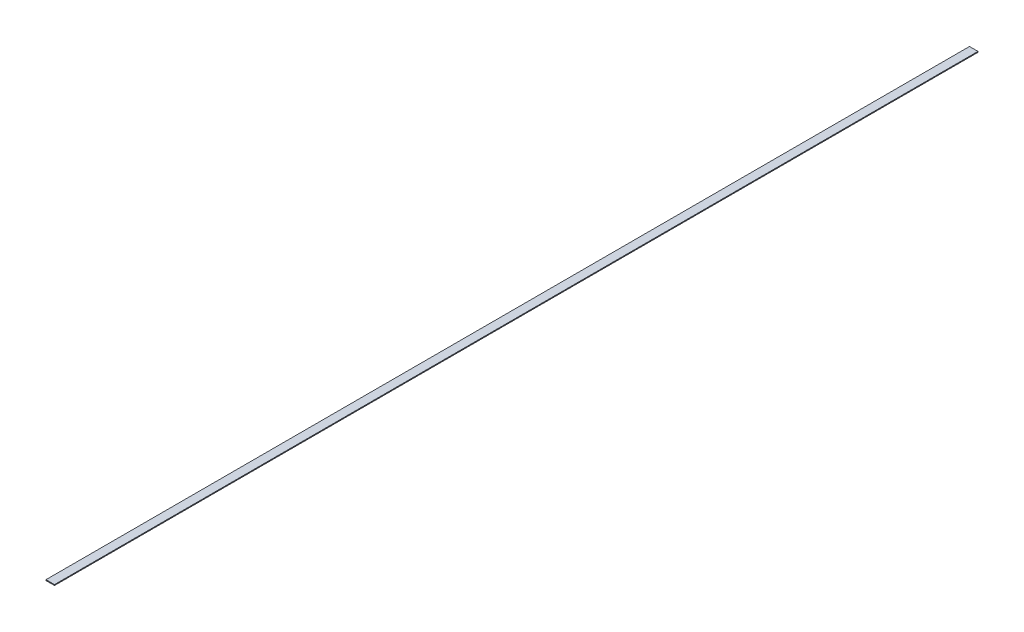
ISO-10303-21;
HEADER;
FILE_DESCRIPTION(('STEP AP214'),'2;1');
FILE_NAME('part.step','',(''),(''),'','','');
FILE_SCHEMA(('AUTOMOTIVE_DESIGN { 1 0 10303 214 1 1 1 1 }'));
ENDSEC;
DATA;
#1=APPLICATION_CONTEXT('core data for automotive mechanical design processes');
#2=APPLICATION_PROTOCOL_DEFINITION('international standard','automotive_design',2000,#1);
#3=PRODUCT_CONTEXT('',#1,'mechanical');
#4=PRODUCT('Part','Part','',(#3));
#5=PRODUCT_RELATED_PRODUCT_CATEGORY('part','',(#4));
#6=PRODUCT_DEFINITION_FORMATION('','',#4);
#7=PRODUCT_DEFINITION_CONTEXT('part definition',#1,'design');
#8=PRODUCT_DEFINITION('design','',#6,#7);
#9=PRODUCT_DEFINITION_SHAPE('','',#8);
#10=(LENGTH_UNIT() NAMED_UNIT(*) SI_UNIT(.MILLI.,.METRE.));
#11=(NAMED_UNIT(*) PLANE_ANGLE_UNIT() SI_UNIT($,.RADIAN.));
#12=(NAMED_UNIT(*) SI_UNIT($,.STERADIAN.) SOLID_ANGLE_UNIT());
#13=UNCERTAINTY_MEASURE_WITH_UNIT(LENGTH_MEASURE(1.E-05),#10,'distance_accuracy_value','');
#14=(GEOMETRIC_REPRESENTATION_CONTEXT(3) GLOBAL_UNCERTAINTY_ASSIGNED_CONTEXT((#13)) GLOBAL_UNIT_ASSIGNED_CONTEXT((#10,
#11,#12)) REPRESENTATION_CONTEXT('',''));
#15=CARTESIAN_POINT('',(0.,0.,0.));
#16=DIRECTION('',(0.,0.,1.));
#17=DIRECTION('',(1.,0.,0.));
#18=AXIS2_PLACEMENT_3D('',#15,#16,#17);
#19=CARTESIAN_POINT('',(0.,5.08,0.));
#20=DIRECTION('',(1.,0.,0.));
#21=DIRECTION('',(0.,0.,-1.));
#22=AXIS2_PLACEMENT_3D('',#19,#20,#21);
#23=PLANE('',#22);
#24=DIRECTION('',(0.,0.,1.));
#25=VECTOR('',#24,1.);
#26=CARTESIAN_POINT('',(0.,0.,0.));
#27=LINE('',#26,#25);
#28=CARTESIAN_POINT('',(0.,0.,-5518.15));
#29=VERTEX_POINT('',#28);
#30=CARTESIAN_POINT('',(0.,0.,0.));
#31=VERTEX_POINT('',#30);
#32=EDGE_CURVE('E104',#29,#31,#27,.T.);
#33=ORIENTED_EDGE('',*,*,#32,.T.);
#34=DIRECTION('',(0.,-1.,0.));
#35=VECTOR('',#34,1.);
#36=CARTESIAN_POINT('',(0.,5.08,0.));
#37=LINE('',#36,#35);
#38=CARTESIAN_POINT('',(0.,5.08,0.));
#39=VERTEX_POINT('',#38);
#40=EDGE_CURVE('E11',#39,#31,#37,.T.);
#41=ORIENTED_EDGE('',*,*,#40,.F.);
#42=DIRECTION('',(0.,0.,1.));
#43=VECTOR('',#42,1.);
#44=CARTESIAN_POINT('',(0.,5.08,0.));
#45=LINE('',#44,#43);
#46=CARTESIAN_POINT('',(0.,5.08,-5518.15));
#47=VERTEX_POINT('',#46);
#48=EDGE_CURVE('E92',#47,#39,#45,.T.);
#49=ORIENTED_EDGE('',*,*,#48,.F.);
#50=DIRECTION('',(0.,-1.,0.));
#51=VECTOR('',#50,1.);
#52=CARTESIAN_POINT('',(0.,5.08,-5518.15));
#53=LINE('',#52,#51);
#54=EDGE_CURVE('E100',#47,#29,#53,.T.);
#55=ORIENTED_EDGE('',*,*,#54,.T.);
#56=EDGE_LOOP('',(#33,#41,#49,#55));
#57=FACE_BOUND('',#56,.T.);
#58=ADVANCED_FACE('F41',(#57),#23,.F.);
#59=CARTESIAN_POINT('',(0.,5.08,0.));
#60=DIRECTION('',(0.,0.,-1.));
#61=DIRECTION('',(-1.,0.,0.));
#62=AXIS2_PLACEMENT_3D('',#59,#60,#61);
#63=PLANE('',#62);
#64=DIRECTION('',(1.,0.,0.));
#65=VECTOR('',#64,1.);
#66=CARTESIAN_POINT('',(0.,0.,0.));
#67=LINE('',#66,#65);
#68=CARTESIAN_POINT('',(50.8,0.,0.));
#69=VERTEX_POINT('',#68);
#70=EDGE_CURVE('E96',#31,#69,#67,.T.);
#71=ORIENTED_EDGE('',*,*,#70,.T.);
#72=DIRECTION('',(0.,-1.,0.));
#73=VECTOR('',#72,1.);
#74=CARTESIAN_POINT('',(50.8,5.08,0.));
#75=LINE('',#74,#73);
#76=CARTESIAN_POINT('',(50.8,5.08,0.));
#77=VERTEX_POINT('',#76);
#78=EDGE_CURVE('E49',#77,#69,#75,.T.);
#79=ORIENTED_EDGE('',*,*,#78,.F.);
#80=DIRECTION('',(1.,0.,0.));
#81=VECTOR('',#80,1.);
#82=CARTESIAN_POINT('',(0.,5.08,0.));
#83=LINE('',#82,#81);
#84=EDGE_CURVE('E87',#39,#77,#83,.T.);
#85=ORIENTED_EDGE('',*,*,#84,.F.);
#86=ORIENTED_EDGE('',*,*,#40,.T.);
#87=EDGE_LOOP('',(#71,#79,#85,#86));
#88=FACE_BOUND('',#87,.T.);
#89=ADVANCED_FACE('F95',(#88),#63,.F.);
#90=CARTESIAN_POINT('',(50.8,5.08,0.));
#91=DIRECTION('',(-1.,0.,0.));
#92=DIRECTION('',(0.,0.,1.));
#93=AXIS2_PLACEMENT_3D('',#90,#91,#92);
#94=PLANE('',#93);
#95=DIRECTION('',(0.,0.,-1.));
#96=VECTOR('',#95,1.);
#97=CARTESIAN_POINT('',(50.8,0.,0.));
#98=LINE('',#97,#96);
#99=CARTESIAN_POINT('',(50.8,0.,-5518.15));
#100=VERTEX_POINT('',#99);
#101=EDGE_CURVE('E74',#69,#100,#98,.T.);
#102=ORIENTED_EDGE('',*,*,#101,.T.);
#103=DIRECTION('',(0.,-1.,0.));
#104=VECTOR('',#103,1.);
#105=CARTESIAN_POINT('',(50.8,5.08,-5518.15));
#106=LINE('',#105,#104);
#107=CARTESIAN_POINT('',(50.8,5.08,-5518.15));
#108=VERTEX_POINT('',#107);
#109=EDGE_CURVE('E97',#108,#100,#106,.T.);
#110=ORIENTED_EDGE('',*,*,#109,.F.);
#111=DIRECTION('',(0.,0.,-1.));
#112=VECTOR('',#111,1.);
#113=CARTESIAN_POINT('',(50.8,5.08,0.));
#114=LINE('',#113,#112);
#115=EDGE_CURVE('E90',#77,#108,#114,.T.);
#116=ORIENTED_EDGE('',*,*,#115,.F.);
#117=ORIENTED_EDGE('',*,*,#78,.T.);
#118=EDGE_LOOP('',(#102,#110,#116,#117));
#119=FACE_BOUND('',#118,.T.);
#120=ADVANCED_FACE('F98',(#119),#94,.F.);
#121=CARTESIAN_POINT('',(0.,5.08,-5518.15));
#122=DIRECTION('',(0.,0.,1.));
#123=DIRECTION('',(1.,0.,0.));
#124=AXIS2_PLACEMENT_3D('',#121,#122,#123);
#125=PLANE('',#124);
#126=DIRECTION('',(-1.,0.,0.));
#127=VECTOR('',#126,1.);
#128=CARTESIAN_POINT('',(0.,0.,-5518.15));
#129=LINE('',#128,#127);
#130=EDGE_CURVE('E80',#100,#29,#129,.T.);
#131=ORIENTED_EDGE('',*,*,#130,.T.);
#132=ORIENTED_EDGE('',*,*,#54,.F.);
#133=DIRECTION('',(-1.,0.,0.));
#134=VECTOR('',#133,1.);
#135=CARTESIAN_POINT('',(0.,5.08,-5518.15));
#136=LINE('',#135,#134);
#137=EDGE_CURVE('E57',#108,#47,#136,.T.);
#138=ORIENTED_EDGE('',*,*,#137,.F.);
#139=ORIENTED_EDGE('',*,*,#109,.T.);
#140=EDGE_LOOP('',(#131,#132,#138,#139));
#141=FACE_BOUND('',#140,.T.);
#142=ADVANCED_FACE('F111',(#141),#125,.F.);
#143=CARTESIAN_POINT('',(0.,5.08,0.));
#144=DIRECTION('',(0.,-1.,0.));
#145=DIRECTION('',(0.,0.,-1.));
#146=AXIS2_PLACEMENT_3D('',#143,#144,#145);
#147=PLANE('',#146);
#148=ORIENTED_EDGE('',*,*,#48,.T.);
#149=ORIENTED_EDGE('',*,*,#84,.T.);
#150=ORIENTED_EDGE('',*,*,#115,.T.);
#151=ORIENTED_EDGE('',*,*,#137,.T.);
#152=EDGE_LOOP('',(#148,#149,#150,#151));
#153=FACE_BOUND('',#152,.T.);
#154=ADVANCED_FACE('F88',(#153),#147,.F.);
#155=CARTESIAN_POINT('',(0.,0.,0.));
#156=DIRECTION('',(0.,-1.,0.));
#157=DIRECTION('',(0.,0.,-1.));
#158=AXIS2_PLACEMENT_3D('',#155,#156,#157);
#159=PLANE('',#158);
#160=ORIENTED_EDGE('',*,*,#32,.F.);
#161=ORIENTED_EDGE('',*,*,#130,.F.);
#162=ORIENTED_EDGE('',*,*,#101,.F.);
#163=ORIENTED_EDGE('',*,*,#70,.F.);
#164=EDGE_LOOP('',(#160,#161,#162,#163));
#165=FACE_BOUND('',#164,.T.);
#166=ADVANCED_FACE('F114',(#165),#159,.T.);
#167=CLOSED_SHELL('',(#58,#89,#120,#142,#154,#166));
#168=MANIFOLD_SOLID_BREP('B2',#167);
#169=ADVANCED_BREP_SHAPE_REPRESENTATION('',(#18,#168),#14);
#170=SHAPE_DEFINITION_REPRESENTATION(#9,#169);
ENDSEC;
END-ISO-10303-21;
